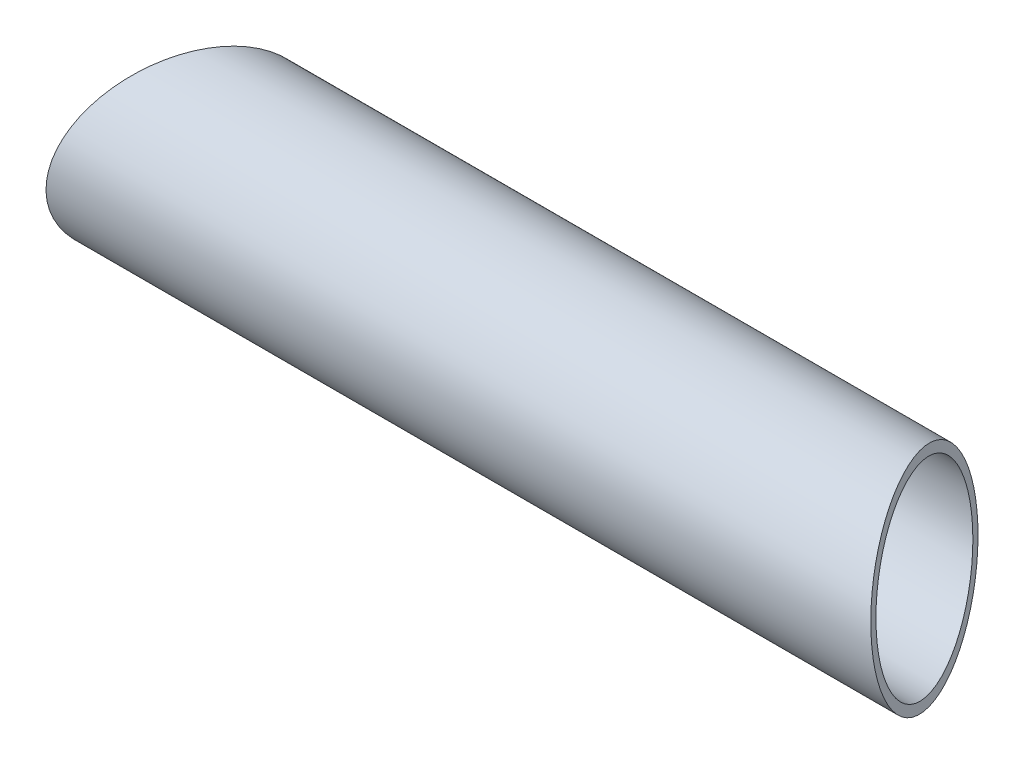
ISO-10303-21;
HEADER;
FILE_DESCRIPTION(('STEP AP214'),'2;1');
FILE_NAME('part.step','',(''),(''),'','','');
FILE_SCHEMA(('AUTOMOTIVE_DESIGN { 1 0 10303 214 1 1 1 1 }'));
ENDSEC;
DATA;
#1=APPLICATION_CONTEXT('core data for automotive mechanical design processes');
#2=APPLICATION_PROTOCOL_DEFINITION('international standard','automotive_design',2000,#1);
#3=PRODUCT_CONTEXT('',#1,'mechanical');
#4=PRODUCT('Part','Part','',(#3));
#5=PRODUCT_RELATED_PRODUCT_CATEGORY('part','',(#4));
#6=PRODUCT_DEFINITION_FORMATION('','',#4);
#7=PRODUCT_DEFINITION_CONTEXT('part definition',#1,'design');
#8=PRODUCT_DEFINITION('design','',#6,#7);
#9=PRODUCT_DEFINITION_SHAPE('','',#8);
#10=(LENGTH_UNIT() NAMED_UNIT(*) SI_UNIT(.MILLI.,.METRE.));
#11=(NAMED_UNIT(*) PLANE_ANGLE_UNIT() SI_UNIT($,.RADIAN.));
#12=(NAMED_UNIT(*) SI_UNIT($,.STERADIAN.) SOLID_ANGLE_UNIT());
#13=UNCERTAINTY_MEASURE_WITH_UNIT(LENGTH_MEASURE(1.E-05),#10,'distance_accuracy_value','');
#14=(GEOMETRIC_REPRESENTATION_CONTEXT(3) GLOBAL_UNCERTAINTY_ASSIGNED_CONTEXT((#13)) GLOBAL_UNIT_ASSIGNED_CONTEXT((#10,
#11,#12)) REPRESENTATION_CONTEXT('',''));
#15=CARTESIAN_POINT('',(0.,0.,0.));
#16=DIRECTION('',(0.,0.,1.));
#17=DIRECTION('',(1.,0.,0.));
#18=AXIS2_PLACEMENT_3D('',#15,#16,#17);
#19=CARTESIAN_POINT('',(-50.,130.,0.));
#20=DIRECTION('',(1.,0.,0.));
#21=DIRECTION('',(0.,1.,0.));
#22=AXIS2_PLACEMENT_3D('',#19,#20,#21);
#23=CYLINDRICAL_SURFACE('',#22,11.3);
#24=CARTESIAN_POINT('',(-50.,130.,0.));
#25=DIRECTION('',(-0.904650427063292,0.140780299510551,-0.402229427173004));
#26=DIRECTION('',(0.426154437750217,0.298851652810821,-0.853861865173774));
#27=AXIS2_PLACEMENT_3D('',#24,#25,#26);
#28=ELLIPSE('',#27,12.4910127292842,11.3);
#29=CARTESIAN_POINT('',(-44.6768994934211,133.732959799428,-10.6655994269359));
#30=VERTEX_POINT('',#29);
#31=EDGE_CURVE('E53',#30,#30,#28,.T.);
#32=ORIENTED_EDGE('',*,*,#31,.T.);
#33=EDGE_LOOP('',(#32));
#34=FACE_BOUND('',#33,.T.);
#35=CARTESIAN_POINT('',(50.,130.,0.));
#36=DIRECTION('',(0.904650427063292,0.140780299510552,-0.402229427173004));
#37=DIRECTION('',(0.426154437750217,-0.298851652810821,0.853861865173774));
#38=AXIS2_PLACEMENT_3D('',#35,#36,#37);
#39=ELLIPSE('',#38,12.4910127292842,11.3);
#40=CARTESIAN_POINT('',(55.323100506579,126.267040200572,10.6655994269361));
#41=VERTEX_POINT('',#40);
#42=EDGE_CURVE('E43',#41,#41,#39,.T.);
#43=ORIENTED_EDGE('',*,*,#42,.T.);
#44=EDGE_LOOP('',(#43));
#45=FACE_BOUND('',#44,.T.);
#46=ADVANCED_FACE('F39',(#34,#45),#23,.F.);
#47=CARTESIAN_POINT('',(-50.,130.,0.));
#48=DIRECTION('',(1.,0.,0.));
#49=DIRECTION('',(0.,1.,0.));
#50=AXIS2_PLACEMENT_3D('',#47,#48,#49);
#51=CYLINDRICAL_SURFACE('',#50,12.5);
#52=CARTESIAN_POINT('',(-50.,130.,0.));
#53=DIRECTION('',(-0.904650427063292,0.140780299510551,-0.402229427173004));
#54=DIRECTION('',(0.426154437750217,0.298851652810821,-0.853861865173774));
#55=AXIS2_PLACEMENT_3D('',#52,#53,#54);
#56=ELLIPSE('',#55,13.8174919571728,12.5);
#57=CARTESIAN_POINT('',(-44.1116144838729,134.129380309101,-11.7982294545751));
#58=VERTEX_POINT('',#57);
#59=EDGE_CURVE('E47',#58,#58,#56,.T.);
#60=ORIENTED_EDGE('',*,*,#59,.F.);
#61=EDGE_LOOP('',(#60));
#62=FACE_BOUND('',#61,.T.);
#63=CARTESIAN_POINT('',(50.,130.,0.));
#64=DIRECTION('',(0.904650427063292,0.140780299510552,-0.402229427173004));
#65=DIRECTION('',(0.426154437750217,-0.298851652810821,0.853861865173774));
#66=AXIS2_PLACEMENT_3D('',#63,#64,#65);
#67=ELLIPSE('',#66,13.8174919571728,12.5);
#68=CARTESIAN_POINT('',(55.8883855161272,125.870619690899,11.7982294545753));
#69=VERTEX_POINT('',#68);
#70=EDGE_CURVE('E10',#69,#69,#67,.T.);
#71=ORIENTED_EDGE('',*,*,#70,.F.);
#72=EDGE_LOOP('',(#71));
#73=FACE_BOUND('',#72,.T.);
#74=ADVANCED_FACE('F67',(#62,#73),#51,.T.);
#75=CARTESIAN_POINT('',(-50.,130.,0.));
#76=DIRECTION('',(-0.904650427063292,0.140780299510551,-0.402229427173004));
#77=DIRECTION('',(-0.406275581998161,0.,0.913750595880548));
#78=AXIS2_PLACEMENT_3D('',#75,#76,#77);
#79=PLANE('',#78);
#80=ORIENTED_EDGE('',*,*,#31,.F.);
#81=EDGE_LOOP('',(#80));
#82=FACE_BOUND('',#81,.T.);
#83=ORIENTED_EDGE('',*,*,#59,.T.);
#84=EDGE_LOOP('',(#83));
#85=FACE_BOUND('',#84,.T.);
#86=ADVANCED_FACE('F62',(#82,#85),#79,.T.);
#87=CARTESIAN_POINT('',(50.,130.,0.));
#88=DIRECTION('',(0.904650427063292,0.140780299510552,-0.402229427173004));
#89=DIRECTION('',(-0.406275581998161,0.,-0.913750595880547));
#90=AXIS2_PLACEMENT_3D('',#87,#88,#89);
#91=PLANE('',#90);
#92=ORIENTED_EDGE('',*,*,#42,.F.);
#93=EDGE_LOOP('',(#92));
#94=FACE_BOUND('',#93,.T.);
#95=ORIENTED_EDGE('',*,*,#70,.T.);
#96=EDGE_LOOP('',(#95));
#97=FACE_BOUND('',#96,.T.);
#98=ADVANCED_FACE('F41',(#94,#97),#91,.T.);
#99=CLOSED_SHELL('',(#46,#74,#86,#98));
#100=MANIFOLD_SOLID_BREP('B2',#99);
#101=ADVANCED_BREP_SHAPE_REPRESENTATION('',(#18,#100),#14);
#102=SHAPE_DEFINITION_REPRESENTATION(#9,#101);
ENDSEC;
END-ISO-10303-21;
